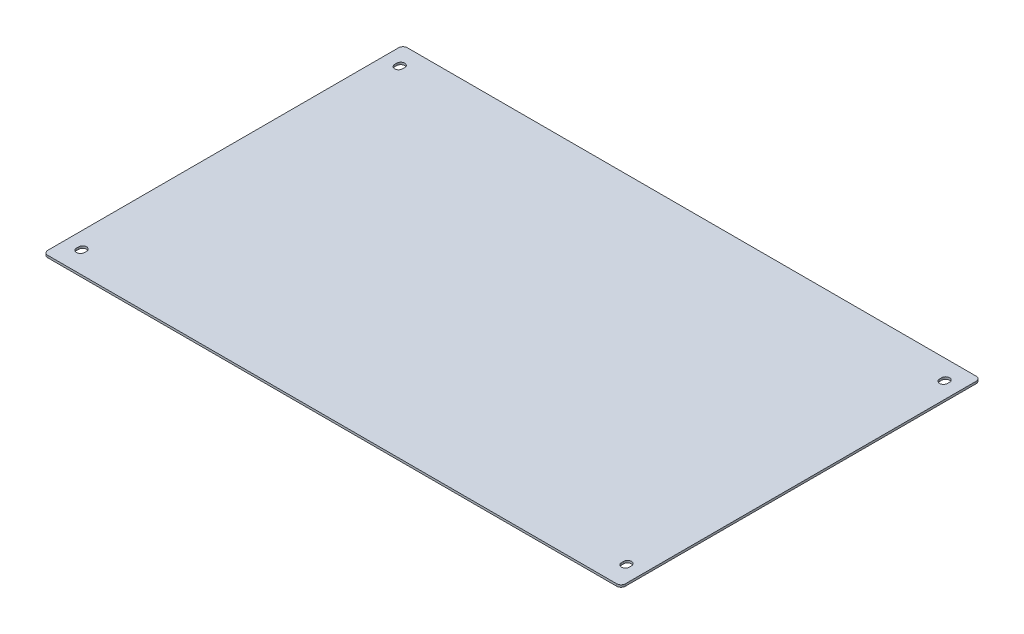
ISO-10303-21;
HEADER;
FILE_DESCRIPTION(('STEP AP214'),'2;1');
FILE_NAME('part.step','',(''),(''),'','','');
FILE_SCHEMA(('AUTOMOTIVE_DESIGN { 1 0 10303 214 1 1 1 1 }'));
ENDSEC;
DATA;
#1=APPLICATION_CONTEXT('core data for automotive mechanical design processes');
#2=APPLICATION_PROTOCOL_DEFINITION('international standard','automotive_design',2000,#1);
#3=PRODUCT_CONTEXT('',#1,'mechanical');
#4=PRODUCT('Part','Part','',(#3));
#5=PRODUCT_RELATED_PRODUCT_CATEGORY('part','',(#4));
#6=PRODUCT_DEFINITION_FORMATION('','',#4);
#7=PRODUCT_DEFINITION_CONTEXT('part definition',#1,'design');
#8=PRODUCT_DEFINITION('design','',#6,#7);
#9=PRODUCT_DEFINITION_SHAPE('','',#8);
#10=(LENGTH_UNIT() NAMED_UNIT(*) SI_UNIT(.MILLI.,.METRE.));
#11=(NAMED_UNIT(*) PLANE_ANGLE_UNIT() SI_UNIT($,.RADIAN.));
#12=(NAMED_UNIT(*) SI_UNIT($,.STERADIAN.) SOLID_ANGLE_UNIT());
#13=UNCERTAINTY_MEASURE_WITH_UNIT(LENGTH_MEASURE(1.E-05),#10,'distance_accuracy_value','');
#14=(GEOMETRIC_REPRESENTATION_CONTEXT(3) GLOBAL_UNCERTAINTY_ASSIGNED_CONTEXT((#13)) GLOBAL_UNIT_ASSIGNED_CONTEXT((#10,
#11,#12)) REPRESENTATION_CONTEXT('',''));
#15=CARTESIAN_POINT('',(0.,0.,0.));
#16=DIRECTION('',(0.,0.,1.));
#17=DIRECTION('',(1.,0.,0.));
#18=AXIS2_PLACEMENT_3D('',#15,#16,#17);
#19=CARTESIAN_POINT('',(0.,-1.,0.));
#20=DIRECTION('',(0.,-1.,0.));
#21=DIRECTION('',(0.,0.,-1.));
#22=AXIS2_PLACEMENT_3D('',#19,#20,#21);
#23=PLANE('',#22);
#24=DIRECTION('',(-1.,0.,0.));
#25=VECTOR('',#24,1.);
#26=CARTESIAN_POINT('',(-117.,-1.,-82.5));
#27=LINE('',#26,#25);
#28=CARTESIAN_POINT('',(130.534291735289,-1.0000000000001,-82.5));
#29=VERTEX_POINT('',#28);
#30=CARTESIAN_POINT('',(-130.534291735289,-1.0000000000001,-82.5));
#31=VERTEX_POINT('',#30);
#32=EDGE_CURVE('E97',#29,#31,#27,.T.);
#33=ORIENTED_EDGE('',*,*,#32,.F.);
#34=CARTESIAN_POINT('',(130.534291735289,-1.0000000000001,-80.5));
#35=DIRECTION('',(0.,1.,0.));
#36=DIRECTION('',(-1.,0.,0.));
#37=AXIS2_PLACEMENT_3D('',#34,#35,#36);
#38=CIRCLE('',#37,2.);
#39=CARTESIAN_POINT('',(132.534291735289,-1.0000000000001,-80.5));
#40=VERTEX_POINT('',#39);
#41=EDGE_CURVE('E304',#29,#40,#38,.F.);
#42=ORIENTED_EDGE('',*,*,#41,.T.);
#43=DIRECTION('',(0.,0.,1.));
#44=VECTOR('',#43,1.);
#45=CARTESIAN_POINT('',(132.534291735289,-1.0000000000001,0.));
#46=LINE('',#45,#44);
#47=CARTESIAN_POINT('',(132.534291735289,-1.0000000000001,80.5));
#48=VERTEX_POINT('',#47);
#49=EDGE_CURVE('E301',#40,#48,#46,.T.);
#50=ORIENTED_EDGE('',*,*,#49,.T.);
#51=CARTESIAN_POINT('',(130.534291735289,-1.0000000000001,80.5));
#52=DIRECTION('',(0.,1.,0.));
#53=DIRECTION('',(-1.,0.,0.));
#54=AXIS2_PLACEMENT_3D('',#51,#52,#53);
#55=CIRCLE('',#54,2.);
#56=CARTESIAN_POINT('',(130.534291735289,-1.0000000000001,82.5));
#57=VERTEX_POINT('',#56);
#58=EDGE_CURVE('E297',#48,#57,#55,.F.);
#59=ORIENTED_EDGE('',*,*,#58,.T.);
#60=DIRECTION('',(1.,0.,0.));
#61=VECTOR('',#60,1.);
#62=CARTESIAN_POINT('',(-117.,-1.,82.5));
#63=LINE('',#62,#61);
#64=CARTESIAN_POINT('',(-130.534291735289,-1.0000000000001,82.5));
#65=VERTEX_POINT('',#64);
#66=EDGE_CURVE('E13',#65,#57,#63,.T.);
#67=ORIENTED_EDGE('',*,*,#66,.F.);
#68=CARTESIAN_POINT('',(-130.534291735289,-1.0000000000001,80.5));
#69=DIRECTION('',(0.,1.,0.));
#70=DIRECTION('',(-1.,0.,0.));
#71=AXIS2_PLACEMENT_3D('',#68,#69,#70);
#72=CIRCLE('',#71,2.);
#73=CARTESIAN_POINT('',(-132.534291735289,-1.0000000000001,80.5));
#74=VERTEX_POINT('',#73);
#75=EDGE_CURVE('E450',#65,#74,#72,.F.);
#76=ORIENTED_EDGE('',*,*,#75,.T.);
#77=DIRECTION('',(0.,0.,-1.));
#78=VECTOR('',#77,1.);
#79=CARTESIAN_POINT('',(-132.534291735289,-1.0000000000001,0.));
#80=LINE('',#79,#78);
#81=CARTESIAN_POINT('',(-132.534291735289,-1.0000000000001,-80.5));
#82=VERTEX_POINT('',#81);
#83=EDGE_CURVE('E276',#74,#82,#80,.T.);
#84=ORIENTED_EDGE('',*,*,#83,.T.);
#85=CARTESIAN_POINT('',(-130.534291735289,-1.0000000000001,-80.5));
#86=DIRECTION('',(0.,1.,0.));
#87=DIRECTION('',(-1.,0.,0.));
#88=AXIS2_PLACEMENT_3D('',#85,#86,#87);
#89=CIRCLE('',#88,2.);
#90=EDGE_CURVE('E446',#82,#31,#89,.F.);
#91=ORIENTED_EDGE('',*,*,#90,.T.);
#92=EDGE_LOOP('',(#33,#42,#50,#59,#67,#76,#84,#91));
#93=FACE_BOUND('',#92,.T.);
#94=DIRECTION('',(0.,0.,-1.));
#95=VECTOR('',#94,1.);
#96=CARTESIAN_POINT('',(123.234291735288,-1.00000000000004,73.));
#97=LINE('',#96,#95);
#98=CARTESIAN_POINT('',(123.234291735288,-1.00000000000004,73.));
#99=VERTEX_POINT('',#98);
#100=CARTESIAN_POINT('',(123.234291735288,-1.00000000000004,72.));
#101=VERTEX_POINT('',#100);
#102=EDGE_CURVE('E307',#99,#101,#97,.T.);
#103=ORIENTED_EDGE('',*,*,#102,.F.);
#104=CARTESIAN_POINT('',(125.034291735289,-1.00000000000004,73.));
#105=DIRECTION('',(0.,-1.,0.));
#106=DIRECTION('',(1.,0.,0.));
#107=AXIS2_PLACEMENT_3D('',#104,#105,#106);
#108=CIRCLE('',#107,1.80000000000003);
#109=CARTESIAN_POINT('',(126.834291735289,-1.00000000000007,73.));
#110=VERTEX_POINT('',#109);
#111=EDGE_CURVE('E317',#110,#99,#108,.T.);
#112=ORIENTED_EDGE('',*,*,#111,.F.);
#113=DIRECTION('',(0.,0.,1.));
#114=VECTOR('',#113,1.);
#115=CARTESIAN_POINT('',(126.834291735289,-1.00000000000007,73.));
#116=LINE('',#115,#114);
#117=CARTESIAN_POINT('',(126.834291735289,-1.00000000000007,72.));
#118=VERTEX_POINT('',#117);
#119=EDGE_CURVE('E325',#118,#110,#116,.T.);
#120=ORIENTED_EDGE('',*,*,#119,.F.);
#121=CARTESIAN_POINT('',(125.034291735289,-1.00000000000004,72.));
#122=DIRECTION('',(0.,-1.,0.));
#123=DIRECTION('',(1.,0.,0.));
#124=AXIS2_PLACEMENT_3D('',#121,#122,#123);
#125=CIRCLE('',#124,1.80000000000003);
#126=EDGE_CURVE('E334',#101,#118,#125,.T.);
#127=ORIENTED_EDGE('',*,*,#126,.F.);
#128=EDGE_LOOP('',(#103,#112,#120,#127));
#129=FACE_BOUND('',#128,.T.);
#130=DIRECTION('',(0.,0.,-1.));
#131=VECTOR('',#130,1.);
#132=CARTESIAN_POINT('',(123.234291735288,-1.00000000000004,-73.));
#133=LINE('',#132,#131);
#134=CARTESIAN_POINT('',(123.234291735288,-1.00000000000004,-73.));
#135=VERTEX_POINT('',#134);
#136=CARTESIAN_POINT('',(123.234291735289,-1.00000000000004,-74.));
#137=VERTEX_POINT('',#136);
#138=EDGE_CURVE('E344',#135,#137,#133,.T.);
#139=ORIENTED_EDGE('',*,*,#138,.F.);
#140=CARTESIAN_POINT('',(125.034291735289,-1.00000000000004,-73.));
#141=DIRECTION('',(0.,-1.,0.));
#142=DIRECTION('',(1.,0.,0.));
#143=AXIS2_PLACEMENT_3D('',#140,#141,#142);
#144=CIRCLE('',#143,1.80000000000003);
#145=CARTESIAN_POINT('',(126.834291735289,-1.00000000000007,-73.));
#146=VERTEX_POINT('',#145);
#147=EDGE_CURVE('E354',#146,#135,#144,.T.);
#148=ORIENTED_EDGE('',*,*,#147,.F.);
#149=DIRECTION('',(0.,0.,1.));
#150=VECTOR('',#149,1.);
#151=CARTESIAN_POINT('',(126.834291735289,-1.00000000000007,-73.));
#152=LINE('',#151,#150);
#153=CARTESIAN_POINT('',(126.834291735289,-1.00000000000007,-74.));
#154=VERTEX_POINT('',#153);
#155=EDGE_CURVE('E362',#154,#146,#152,.T.);
#156=ORIENTED_EDGE('',*,*,#155,.F.);
#157=CARTESIAN_POINT('',(125.034291735289,-1.00000000000004,-74.));
#158=DIRECTION('',(0.,-1.,0.));
#159=DIRECTION('',(1.,0.,0.));
#160=AXIS2_PLACEMENT_3D('',#157,#158,#159);
#161=CIRCLE('',#160,1.80000000000002);
#162=EDGE_CURVE('E371',#137,#154,#161,.T.);
#163=ORIENTED_EDGE('',*,*,#162,.F.);
#164=EDGE_LOOP('',(#139,#148,#156,#163));
#165=FACE_BOUND('',#164,.T.);
#166=DIRECTION('',(0.,0.,1.));
#167=VECTOR('',#166,1.);
#168=CARTESIAN_POINT('',(-126.834291735289,-1.0000000000001,73.));
#169=LINE('',#168,#167);
#170=CARTESIAN_POINT('',(-126.834291735289,-1.0000000000001,72.));
#171=VERTEX_POINT('',#170);
#172=CARTESIAN_POINT('',(-126.834291735289,-1.0000000000001,73.));
#173=VERTEX_POINT('',#172);
#174=EDGE_CURVE('E431',#171,#173,#169,.T.);
#175=ORIENTED_EDGE('',*,*,#174,.T.);
#176=CARTESIAN_POINT('',(-125.034291735289,-1.0000000000001,73.));
#177=DIRECTION('',(0.,1.,0.));
#178=DIRECTION('',(-1.,0.,0.));
#179=AXIS2_PLACEMENT_3D('',#176,#177,#178);
#180=CIRCLE('',#179,1.80000000000003);
#181=CARTESIAN_POINT('',(-123.234291735289,-1.0000000000001,73.));
#182=VERTEX_POINT('',#181);
#183=EDGE_CURVE('E426',#173,#182,#180,.T.);
#184=ORIENTED_EDGE('',*,*,#183,.T.);
#185=DIRECTION('',(0.,0.,-1.));
#186=VECTOR('',#185,1.);
#187=CARTESIAN_POINT('',(-123.234291735289,-1.0000000000001,73.));
#188=LINE('',#187,#186);
#189=CARTESIAN_POINT('',(-123.234291735289,-1.00000000000004,72.));
#190=VERTEX_POINT('',#189);
#191=EDGE_CURVE('E421',#182,#190,#188,.T.);
#192=ORIENTED_EDGE('',*,*,#191,.T.);
#193=CARTESIAN_POINT('',(-125.034291735289,-1.0000000000001,72.));
#194=DIRECTION('',(0.,1.,0.));
#195=DIRECTION('',(-1.,0.,0.));
#196=AXIS2_PLACEMENT_3D('',#193,#194,#195);
#197=CIRCLE('',#196,1.80000000000003);
#198=EDGE_CURVE('E416',#190,#171,#197,.T.);
#199=ORIENTED_EDGE('',*,*,#198,.T.);
#200=EDGE_LOOP('',(#175,#184,#192,#199));
#201=FACE_BOUND('',#200,.T.);
#202=DIRECTION('',(0.,0.,1.));
#203=VECTOR('',#202,1.);
#204=CARTESIAN_POINT('',(-126.834291735289,-1.0000000000001,-73.));
#205=LINE('',#204,#203);
#206=CARTESIAN_POINT('',(-126.834291735289,-1.0000000000001,-74.));
#207=VERTEX_POINT('',#206);
#208=CARTESIAN_POINT('',(-126.834291735289,-1.0000000000001,-73.));
#209=VERTEX_POINT('',#208);
#210=EDGE_CURVE('E411',#207,#209,#205,.T.);
#211=ORIENTED_EDGE('',*,*,#210,.T.);
#212=CARTESIAN_POINT('',(-125.034291735289,-1.0000000000001,-73.));
#213=DIRECTION('',(0.,1.,0.));
#214=DIRECTION('',(-1.,0.,0.));
#215=AXIS2_PLACEMENT_3D('',#212,#213,#214);
#216=CIRCLE('',#215,1.80000000000003);
#217=CARTESIAN_POINT('',(-123.234291735289,-1.0000000000001,-73.));
#218=VERTEX_POINT('',#217);
#219=EDGE_CURVE('E406',#209,#218,#216,.T.);
#220=ORIENTED_EDGE('',*,*,#219,.T.);
#221=DIRECTION('',(0.,0.,-1.));
#222=VECTOR('',#221,1.);
#223=CARTESIAN_POINT('',(-123.234291735289,-1.0000000000001,-73.));
#224=LINE('',#223,#222);
#225=CARTESIAN_POINT('',(-123.234291735289,-1.00000000000004,-74.));
#226=VERTEX_POINT('',#225);
#227=EDGE_CURVE('E401',#218,#226,#224,.T.);
#228=ORIENTED_EDGE('',*,*,#227,.T.);
#229=CARTESIAN_POINT('',(-125.034291735289,-1.0000000000001,-74.));
#230=DIRECTION('',(0.,1.,0.));
#231=DIRECTION('',(-1.,0.,0.));
#232=AXIS2_PLACEMENT_3D('',#229,#230,#231);
#233=CIRCLE('',#232,1.80000000000002);
#234=EDGE_CURVE('E394',#226,#207,#233,.T.);
#235=ORIENTED_EDGE('',*,*,#234,.T.);
#236=EDGE_LOOP('',(#211,#220,#228,#235));
#237=FACE_BOUND('',#236,.T.);
#238=ADVANCED_FACE('F86',(#93,#129,#165,#201,#237),#23,.T.);
#239=CARTESIAN_POINT('',(0.,0.,0.));
#240=DIRECTION('',(0.,-1.,0.));
#241=DIRECTION('',(0.,0.,-1.));
#242=AXIS2_PLACEMENT_3D('',#239,#240,#241);
#243=PLANE('',#242);
#244=DIRECTION('',(1.,0.,0.));
#245=VECTOR('',#244,1.);
#246=CARTESIAN_POINT('',(-117.,0.,82.5));
#247=LINE('',#246,#245);
#248=CARTESIAN_POINT('',(-130.534291735289,0.,82.5));
#249=VERTEX_POINT('',#248);
#250=CARTESIAN_POINT('',(130.534291735289,0.,82.5));
#251=VERTEX_POINT('',#250);
#252=EDGE_CURVE('E90',#249,#251,#247,.T.);
#253=ORIENTED_EDGE('',*,*,#252,.T.);
#254=CARTESIAN_POINT('',(130.534291735289,0.,80.5));
#255=DIRECTION('',(0.,1.,0.));
#256=DIRECTION('',(-1.,0.,0.));
#257=AXIS2_PLACEMENT_3D('',#254,#255,#256);
#258=CIRCLE('',#257,2.);
#259=CARTESIAN_POINT('',(132.534291735289,0.,80.5));
#260=VERTEX_POINT('',#259);
#261=EDGE_CURVE('E106',#251,#260,#258,.T.);
#262=ORIENTED_EDGE('',*,*,#261,.T.);
#263=DIRECTION('',(0.,0.,-1.));
#264=VECTOR('',#263,1.);
#265=CARTESIAN_POINT('',(132.534291735289,0.,82.5));
#266=LINE('',#265,#264);
#267=CARTESIAN_POINT('',(132.534291735289,0.,-80.5));
#268=VERTEX_POINT('',#267);
#269=EDGE_CURVE('E382',#268,#260,#266,.F.);
#270=ORIENTED_EDGE('',*,*,#269,.F.);
#271=CARTESIAN_POINT('',(130.534291735289,0.,-80.5));
#272=DIRECTION('',(0.,1.,0.));
#273=DIRECTION('',(-1.,0.,0.));
#274=AXIS2_PLACEMENT_3D('',#271,#272,#273);
#275=CIRCLE('',#274,2.);
#276=CARTESIAN_POINT('',(130.534291735289,0.,-82.5));
#277=VERTEX_POINT('',#276);
#278=EDGE_CURVE('E291',#268,#277,#275,.T.);
#279=ORIENTED_EDGE('',*,*,#278,.T.);
#280=DIRECTION('',(-1.,0.,0.));
#281=VECTOR('',#280,1.);
#282=CARTESIAN_POINT('',(-117.,0.,-82.5));
#283=LINE('',#282,#281);
#284=CARTESIAN_POINT('',(-130.534291735289,0.,-82.5));
#285=VERTEX_POINT('',#284);
#286=EDGE_CURVE('E252',#277,#285,#283,.T.);
#287=ORIENTED_EDGE('',*,*,#286,.T.);
#288=CARTESIAN_POINT('',(-130.534291735289,0.,-80.5));
#289=DIRECTION('',(0.,1.,0.));
#290=DIRECTION('',(-1.,0.,0.));
#291=AXIS2_PLACEMENT_3D('',#288,#289,#290);
#292=CIRCLE('',#291,2.);
#293=CARTESIAN_POINT('',(-132.534291735289,0.,-80.5));
#294=VERTEX_POINT('',#293);
#295=EDGE_CURVE('E267',#285,#294,#292,.T.);
#296=ORIENTED_EDGE('',*,*,#295,.T.);
#297=DIRECTION('',(0.,0.,1.));
#298=VECTOR('',#297,1.);
#299=CARTESIAN_POINT('',(-132.534291735289,0.,-82.5));
#300=LINE('',#299,#298);
#301=CARTESIAN_POINT('',(-132.534291735289,0.,80.5));
#302=VERTEX_POINT('',#301);
#303=EDGE_CURVE('E273',#302,#294,#300,.F.);
#304=ORIENTED_EDGE('',*,*,#303,.F.);
#305=CARTESIAN_POINT('',(-130.534291735289,0.,80.5));
#306=DIRECTION('',(0.,1.,0.));
#307=DIRECTION('',(-1.,0.,0.));
#308=AXIS2_PLACEMENT_3D('',#305,#306,#307);
#309=CIRCLE('',#308,2.);
#310=EDGE_CURVE('E258',#302,#249,#309,.T.);
#311=ORIENTED_EDGE('',*,*,#310,.T.);
#312=EDGE_LOOP('',(#253,#262,#270,#279,#287,#296,#304,#311));
#313=FACE_BOUND('',#312,.T.);
#314=CARTESIAN_POINT('',(125.034291735289,0.,73.));
#315=DIRECTION('',(0.,1.,0.));
#316=DIRECTION('',(-1.,0.,0.));
#317=AXIS2_PLACEMENT_3D('',#314,#315,#316);
#318=CIRCLE('',#317,1.80000000000003);
#319=CARTESIAN_POINT('',(123.234291735288,0.,73.));
#320=VERTEX_POINT('',#319);
#321=CARTESIAN_POINT('',(126.834291735289,0.,73.));
#322=VERTEX_POINT('',#321);
#323=EDGE_CURVE('E322',#320,#322,#318,.T.);
#324=ORIENTED_EDGE('',*,*,#323,.F.);
#325=DIRECTION('',(0.,0.,1.));
#326=VECTOR('',#325,1.);
#327=CARTESIAN_POINT('',(123.234291735288,0.,0.));
#328=LINE('',#327,#326);
#329=CARTESIAN_POINT('',(123.234291735288,0.,72.));
#330=VERTEX_POINT('',#329);
#331=EDGE_CURVE('E314',#330,#320,#328,.T.);
#332=ORIENTED_EDGE('',*,*,#331,.F.);
#333=CARTESIAN_POINT('',(125.034291735289,0.,72.));
#334=DIRECTION('',(0.,1.,0.));
#335=DIRECTION('',(-1.,0.,0.));
#336=AXIS2_PLACEMENT_3D('',#333,#334,#335);
#337=CIRCLE('',#336,1.80000000000003);
#338=CARTESIAN_POINT('',(126.834291735289,0.,72.));
#339=VERTEX_POINT('',#338);
#340=EDGE_CURVE('E340',#339,#330,#337,.T.);
#341=ORIENTED_EDGE('',*,*,#340,.F.);
#342=DIRECTION('',(0.,0.,-1.));
#343=VECTOR('',#342,1.);
#344=CARTESIAN_POINT('',(126.834291735289,0.,0.));
#345=LINE('',#344,#343);
#346=EDGE_CURVE('E331',#322,#339,#345,.T.);
#347=ORIENTED_EDGE('',*,*,#346,.F.);
#348=EDGE_LOOP('',(#324,#332,#341,#347));
#349=FACE_BOUND('',#348,.T.);
#350=CARTESIAN_POINT('',(125.034291735289,0.,-73.));
#351=DIRECTION('',(0.,1.,0.));
#352=DIRECTION('',(-1.,0.,0.));
#353=AXIS2_PLACEMENT_3D('',#350,#351,#352);
#354=CIRCLE('',#353,1.80000000000003);
#355=CARTESIAN_POINT('',(123.234291735289,0.,-73.));
#356=VERTEX_POINT('',#355);
#357=CARTESIAN_POINT('',(126.834291735289,0.,-73.));
#358=VERTEX_POINT('',#357);
#359=EDGE_CURVE('E359',#356,#358,#354,.T.);
#360=ORIENTED_EDGE('',*,*,#359,.F.);
#361=DIRECTION('',(0.,0.,1.));
#362=VECTOR('',#361,1.);
#363=CARTESIAN_POINT('',(123.234291735287,0.,1.33573707650198E-13));
#364=LINE('',#363,#362);
#365=CARTESIAN_POINT('',(123.234291735289,0.,-74.));
#366=VERTEX_POINT('',#365);
#367=EDGE_CURVE('E351',#366,#356,#364,.T.);
#368=ORIENTED_EDGE('',*,*,#367,.F.);
#369=CARTESIAN_POINT('',(125.034291735289,0.,-74.));
#370=DIRECTION('',(0.,1.,0.));
#371=DIRECTION('',(-1.,0.,0.));
#372=AXIS2_PLACEMENT_3D('',#369,#370,#371);
#373=CIRCLE('',#372,1.80000000000002);
#374=CARTESIAN_POINT('',(126.834291735289,0.,-74.));
#375=VERTEX_POINT('',#374);
#376=EDGE_CURVE('E377',#375,#366,#373,.T.);
#377=ORIENTED_EDGE('',*,*,#376,.F.);
#378=DIRECTION('',(0.,0.,-1.));
#379=VECTOR('',#378,1.);
#380=CARTESIAN_POINT('',(126.83429173529,0.,-1.96023752785408E-13));
#381=LINE('',#380,#379);
#382=EDGE_CURVE('E368',#358,#375,#381,.T.);
#383=ORIENTED_EDGE('',*,*,#382,.F.);
#384=EDGE_LOOP('',(#360,#368,#377,#383));
#385=FACE_BOUND('',#384,.T.);
#386=CARTESIAN_POINT('',(-125.034291735289,0.,73.));
#387=DIRECTION('',(0.,1.,0.));
#388=DIRECTION('',(-1.,0.,0.));
#389=AXIS2_PLACEMENT_3D('',#386,#387,#388);
#390=CIRCLE('',#389,1.80000000000003);
#391=CARTESIAN_POINT('',(-126.834291735289,0.,73.));
#392=VERTEX_POINT('',#391);
#393=CARTESIAN_POINT('',(-123.234291735289,0.,73.));
#394=VERTEX_POINT('',#393);
#395=EDGE_CURVE('E474',#392,#394,#390,.T.);
#396=ORIENTED_EDGE('',*,*,#395,.F.);
#397=DIRECTION('',(0.,0.,1.));
#398=VECTOR('',#397,1.);
#399=CARTESIAN_POINT('',(-126.834291735289,0.,0.));
#400=LINE('',#399,#398);
#401=CARTESIAN_POINT('',(-126.834291735289,0.,72.));
#402=VERTEX_POINT('',#401);
#403=EDGE_CURVE('E468',#402,#392,#400,.T.);
#404=ORIENTED_EDGE('',*,*,#403,.F.);
#405=CARTESIAN_POINT('',(-125.034291735289,0.,72.));
#406=DIRECTION('',(0.,1.,0.));
#407=DIRECTION('',(-1.,0.,0.));
#408=AXIS2_PLACEMENT_3D('',#405,#406,#407);
#409=CIRCLE('',#408,1.80000000000003);
#410=CARTESIAN_POINT('',(-123.234291735289,0.,72.));
#411=VERTEX_POINT('',#410);
#412=EDGE_CURVE('E486',#411,#402,#409,.T.);
#413=ORIENTED_EDGE('',*,*,#412,.F.);
#414=DIRECTION('',(0.,0.,-1.));
#415=VECTOR('',#414,1.);
#416=CARTESIAN_POINT('',(-123.234291735289,0.,0.));
#417=LINE('',#416,#415);
#418=EDGE_CURVE('E480',#394,#411,#417,.T.);
#419=ORIENTED_EDGE('',*,*,#418,.F.);
#420=EDGE_LOOP('',(#396,#404,#413,#419));
#421=FACE_BOUND('',#420,.T.);
#422=CARTESIAN_POINT('',(-125.034291735289,0.,-73.));
#423=DIRECTION('',(0.,1.,0.));
#424=DIRECTION('',(-1.,0.,0.));
#425=AXIS2_PLACEMENT_3D('',#422,#423,#424);
#426=CIRCLE('',#425,1.80000000000003);
#427=CARTESIAN_POINT('',(-126.834291735289,0.,-73.));
#428=VERTEX_POINT('',#427);
#429=CARTESIAN_POINT('',(-123.234291735289,0.,-73.));
#430=VERTEX_POINT('',#429);
#431=EDGE_CURVE('E498',#428,#430,#426,.T.);
#432=ORIENTED_EDGE('',*,*,#431,.F.);
#433=DIRECTION('',(0.,0.,1.));
#434=VECTOR('',#433,1.);
#435=CARTESIAN_POINT('',(-126.834291735291,0.,-1.96023752785422E-13));
#436=LINE('',#435,#434);
#437=CARTESIAN_POINT('',(-126.834291735289,0.,-74.));
#438=VERTEX_POINT('',#437);
#439=EDGE_CURVE('E492',#438,#428,#436,.T.);
#440=ORIENTED_EDGE('',*,*,#439,.F.);
#441=CARTESIAN_POINT('',(-125.034291735289,0.,-74.));
#442=DIRECTION('',(0.,1.,0.));
#443=DIRECTION('',(-1.,0.,0.));
#444=AXIS2_PLACEMENT_3D('',#441,#442,#443);
#445=CIRCLE('',#444,1.80000000000002);
#446=CARTESIAN_POINT('',(-123.234291735289,0.,-74.));
#447=VERTEX_POINT('',#446);
#448=EDGE_CURVE('E277',#447,#438,#445,.T.);
#449=ORIENTED_EDGE('',*,*,#448,.F.);
#450=DIRECTION('',(0.,0.,-1.));
#451=VECTOR('',#450,1.);
#452=CARTESIAN_POINT('',(-123.234291735288,0.,1.33573707650212E-13));
#453=LINE('',#452,#451);
#454=EDGE_CURVE('E504',#430,#447,#453,.T.);
#455=ORIENTED_EDGE('',*,*,#454,.F.);
#456=EDGE_LOOP('',(#432,#440,#449,#455));
#457=FACE_BOUND('',#456,.T.);
#458=ADVANCED_FACE('F88',(#313,#349,#385,#421,#457),#243,.F.);
#459=CARTESIAN_POINT('',(-117.,-1.,-82.5));
#460=DIRECTION('',(0.,0.,-1.));
#461=DIRECTION('',(-1.,0.,0.));
#462=AXIS2_PLACEMENT_3D('',#459,#460,#461);
#463=PLANE('',#462);
#464=ORIENTED_EDGE('',*,*,#286,.F.);
#465=DIRECTION('',(0.,1.,0.));
#466=VECTOR('',#465,1.);
#467=CARTESIAN_POINT('',(130.534291735289,-1.00000000000008,-82.5));
#468=LINE('',#467,#466);
#469=EDGE_CURVE('E294',#277,#29,#468,.F.);
#470=ORIENTED_EDGE('',*,*,#469,.T.);
#471=ORIENTED_EDGE('',*,*,#32,.T.);
#472=DIRECTION('',(0.,1.,0.));
#473=VECTOR('',#472,1.);
#474=CARTESIAN_POINT('',(-130.534291735289,-1.0000000000001,-82.5));
#475=LINE('',#474,#473);
#476=EDGE_CURVE('E266',#31,#285,#475,.T.);
#477=ORIENTED_EDGE('',*,*,#476,.T.);
#478=EDGE_LOOP('',(#464,#470,#471,#477));
#479=FACE_BOUND('',#478,.T.);
#480=ADVANCED_FACE('F543',(#479),#463,.T.);
#481=CARTESIAN_POINT('',(-117.,-1.,82.5));
#482=DIRECTION('',(0.,0.,1.));
#483=DIRECTION('',(1.,0.,0.));
#484=AXIS2_PLACEMENT_3D('',#481,#482,#483);
#485=PLANE('',#484);
#486=ORIENTED_EDGE('',*,*,#66,.T.);
#487=DIRECTION('',(0.,1.,0.));
#488=VECTOR('',#487,1.);
#489=CARTESIAN_POINT('',(130.534291735289,-1.0000000000001,82.5));
#490=LINE('',#489,#488);
#491=EDGE_CURVE('E287',#57,#251,#490,.T.);
#492=ORIENTED_EDGE('',*,*,#491,.T.);
#493=ORIENTED_EDGE('',*,*,#252,.F.);
#494=DIRECTION('',(0.,1.,0.));
#495=VECTOR('',#494,1.);
#496=CARTESIAN_POINT('',(-130.534291735289,-1.00000000000008,82.5));
#497=LINE('',#496,#495);
#498=EDGE_CURVE('E263',#249,#65,#497,.F.);
#499=ORIENTED_EDGE('',*,*,#498,.T.);
#500=EDGE_LOOP('',(#486,#492,#493,#499));
#501=FACE_BOUND('',#500,.T.);
#502=ADVANCED_FACE('F549',(#501),#485,.T.);
#503=CARTESIAN_POINT('',(130.534291735289,-1.0000000000001,80.5));
#504=DIRECTION('',(0.,1.,0.));
#505=DIRECTION('',(-1.,0.,0.));
#506=AXIS2_PLACEMENT_3D('',#503,#504,#505);
#507=CYLINDRICAL_SURFACE('',#506,2.);
#508=ORIENTED_EDGE('',*,*,#58,.F.);
#509=DIRECTION('',(0.,1.,0.));
#510=VECTOR('',#509,1.);
#511=CARTESIAN_POINT('',(132.534291735289,-1.0000000000001,80.5));
#512=LINE('',#511,#510);
#513=EDGE_CURVE('E177',#260,#48,#512,.F.);
#514=ORIENTED_EDGE('',*,*,#513,.F.);
#515=ORIENTED_EDGE('',*,*,#261,.F.);
#516=ORIENTED_EDGE('',*,*,#491,.F.);
#517=EDGE_LOOP('',(#508,#514,#515,#516));
#518=FACE_BOUND('',#517,.T.);
#519=ADVANCED_FACE('F551',(#518),#507,.T.);
#520=CARTESIAN_POINT('',(132.534291735289,-1.0000000000001,82.5));
#521=DIRECTION('',(-1.,0.,0.));
#522=DIRECTION('',(0.,-1.,0.));
#523=AXIS2_PLACEMENT_3D('',#520,#521,#522);
#524=PLANE('',#523);
#525=ORIENTED_EDGE('',*,*,#49,.F.);
#526=DIRECTION('',(0.,1.,0.));
#527=VECTOR('',#526,1.);
#528=CARTESIAN_POINT('',(132.534291735289,-1.0000000000001,-80.5));
#529=LINE('',#528,#527);
#530=EDGE_CURVE('E385',#40,#268,#529,.T.);
#531=ORIENTED_EDGE('',*,*,#530,.T.);
#532=ORIENTED_EDGE('',*,*,#269,.T.);
#533=ORIENTED_EDGE('',*,*,#513,.T.);
#534=EDGE_LOOP('',(#525,#531,#532,#533));
#535=FACE_BOUND('',#534,.T.);
#536=ADVANCED_FACE('F564',(#535),#524,.F.);
#537=CARTESIAN_POINT('',(130.534291735289,-1.00000000000008,-80.5));
#538=DIRECTION('',(0.,1.,0.));
#539=DIRECTION('',(-1.,0.,0.));
#540=AXIS2_PLACEMENT_3D('',#537,#538,#539);
#541=CYLINDRICAL_SURFACE('',#540,2.);
#542=ORIENTED_EDGE('',*,*,#41,.F.);
#543=ORIENTED_EDGE('',*,*,#469,.F.);
#544=ORIENTED_EDGE('',*,*,#278,.F.);
#545=ORIENTED_EDGE('',*,*,#530,.F.);
#546=EDGE_LOOP('',(#542,#543,#544,#545));
#547=FACE_BOUND('',#546,.T.);
#548=ADVANCED_FACE('F562',(#547),#541,.T.);
#549=CARTESIAN_POINT('',(125.03429173529,233.,-74.));
#550=DIRECTION('',(0.,-1.,0.));
#551=DIRECTION('',(1.,0.,0.));
#552=AXIS2_PLACEMENT_3D('',#549,#550,#551);
#553=CYLINDRICAL_SURFACE('',#552,1.80000000000002);
#554=ORIENTED_EDGE('',*,*,#376,.T.);
#555=DIRECTION('',(0.,-1.,0.));
#556=VECTOR('',#555,1.);
#557=CARTESIAN_POINT('',(123.23429173529,233.,-74.));
#558=LINE('',#557,#556);
#559=EDGE_CURVE('E375',#366,#137,#558,.T.);
#560=ORIENTED_EDGE('',*,*,#559,.T.);
#561=ORIENTED_EDGE('',*,*,#162,.T.);
#562=DIRECTION('',(0.,-1.,0.));
#563=VECTOR('',#562,1.);
#564=CARTESIAN_POINT('',(126.83429173529,233.,-74.));
#565=LINE('',#564,#563);
#566=EDGE_CURVE('E366',#375,#154,#565,.T.);
#567=ORIENTED_EDGE('',*,*,#566,.F.);
#568=EDGE_LOOP('',(#554,#560,#561,#567));
#569=FACE_BOUND('',#568,.T.);
#570=ADVANCED_FACE('F579',(#569),#553,.F.);
#571=CARTESIAN_POINT('',(126.83429173529,233.,-73.));
#572=DIRECTION('',(1.,0.,0.));
#573=DIRECTION('',(0.,0.,1.));
#574=AXIS2_PLACEMENT_3D('',#571,#572,#573);
#575=PLANE('',#574);
#576=ORIENTED_EDGE('',*,*,#382,.T.);
#577=ORIENTED_EDGE('',*,*,#566,.T.);
#578=ORIENTED_EDGE('',*,*,#155,.T.);
#579=DIRECTION('',(0.,-1.,0.));
#580=VECTOR('',#579,1.);
#581=CARTESIAN_POINT('',(126.83429173529,233.,-73.));
#582=LINE('',#581,#580);
#583=EDGE_CURVE('E357',#358,#146,#582,.T.);
#584=ORIENTED_EDGE('',*,*,#583,.F.);
#585=EDGE_LOOP('',(#576,#577,#578,#584));
#586=FACE_BOUND('',#585,.T.);
#587=ADVANCED_FACE('F582',(#586),#575,.F.);
#588=CARTESIAN_POINT('',(125.03429173529,233.,-73.));
#589=DIRECTION('',(0.,-1.,0.));
#590=DIRECTION('',(1.,0.,0.));
#591=AXIS2_PLACEMENT_3D('',#588,#589,#590);
#592=CYLINDRICAL_SURFACE('',#591,1.80000000000003);
#593=ORIENTED_EDGE('',*,*,#359,.T.);
#594=ORIENTED_EDGE('',*,*,#583,.T.);
#595=ORIENTED_EDGE('',*,*,#147,.T.);
#596=DIRECTION('',(0.,-1.,0.));
#597=VECTOR('',#596,1.);
#598=CARTESIAN_POINT('',(123.23429173529,233.,-73.));
#599=LINE('',#598,#597);
#600=EDGE_CURVE('E348',#356,#135,#599,.T.);
#601=ORIENTED_EDGE('',*,*,#600,.F.);
#602=EDGE_LOOP('',(#593,#594,#595,#601));
#603=FACE_BOUND('',#602,.T.);
#604=ADVANCED_FACE('F586',(#603),#592,.F.);
#605=CARTESIAN_POINT('',(123.23429173529,233.,-73.));
#606=DIRECTION('',(-1.,0.,0.));
#607=DIRECTION('',(0.,0.,-1.));
#608=AXIS2_PLACEMENT_3D('',#605,#606,#607);
#609=PLANE('',#608);
#610=ORIENTED_EDGE('',*,*,#367,.T.);
#611=ORIENTED_EDGE('',*,*,#600,.T.);
#612=ORIENTED_EDGE('',*,*,#138,.T.);
#613=ORIENTED_EDGE('',*,*,#559,.F.);
#614=EDGE_LOOP('',(#610,#611,#612,#613));
#615=FACE_BOUND('',#614,.T.);
#616=ADVANCED_FACE('F590',(#615),#609,.F.);
#617=CARTESIAN_POINT('',(125.03429173529,233.,72.));
#618=DIRECTION('',(0.,-1.,0.));
#619=DIRECTION('',(1.,0.,0.));
#620=AXIS2_PLACEMENT_3D('',#617,#618,#619);
#621=CYLINDRICAL_SURFACE('',#620,1.80000000000003);
#622=ORIENTED_EDGE('',*,*,#340,.T.);
#623=DIRECTION('',(0.,-1.,0.));
#624=VECTOR('',#623,1.);
#625=CARTESIAN_POINT('',(123.23429173529,233.,72.));
#626=LINE('',#625,#624);
#627=EDGE_CURVE('E338',#330,#101,#626,.T.);
#628=ORIENTED_EDGE('',*,*,#627,.T.);
#629=ORIENTED_EDGE('',*,*,#126,.T.);
#630=DIRECTION('',(0.,-1.,0.));
#631=VECTOR('',#630,1.);
#632=CARTESIAN_POINT('',(126.83429173529,233.,72.));
#633=LINE('',#632,#631);
#634=EDGE_CURVE('E329',#339,#118,#633,.T.);
#635=ORIENTED_EDGE('',*,*,#634,.F.);
#636=EDGE_LOOP('',(#622,#628,#629,#635));
#637=FACE_BOUND('',#636,.T.);
#638=ADVANCED_FACE('F594',(#637),#621,.F.);
#639=CARTESIAN_POINT('',(126.83429173529,233.,73.));
#640=DIRECTION('',(1.,0.,0.));
#641=DIRECTION('',(0.,1.,0.));
#642=AXIS2_PLACEMENT_3D('',#639,#640,#641);
#643=PLANE('',#642);
#644=ORIENTED_EDGE('',*,*,#346,.T.);
#645=ORIENTED_EDGE('',*,*,#634,.T.);
#646=ORIENTED_EDGE('',*,*,#119,.T.);
#647=DIRECTION('',(0.,-1.,0.));
#648=VECTOR('',#647,1.);
#649=CARTESIAN_POINT('',(126.83429173529,233.,73.));
#650=LINE('',#649,#648);
#651=EDGE_CURVE('E320',#322,#110,#650,.T.);
#652=ORIENTED_EDGE('',*,*,#651,.F.);
#653=EDGE_LOOP('',(#644,#645,#646,#652));
#654=FACE_BOUND('',#653,.T.);
#655=ADVANCED_FACE('F598',(#654),#643,.F.);
#656=CARTESIAN_POINT('',(125.03429173529,233.,73.));
#657=DIRECTION('',(0.,-1.,0.));
#658=DIRECTION('',(1.,0.,0.));
#659=AXIS2_PLACEMENT_3D('',#656,#657,#658);
#660=CYLINDRICAL_SURFACE('',#659,1.80000000000003);
#661=ORIENTED_EDGE('',*,*,#323,.T.);
#662=ORIENTED_EDGE('',*,*,#651,.T.);
#663=ORIENTED_EDGE('',*,*,#111,.T.);
#664=DIRECTION('',(0.,-1.,0.));
#665=VECTOR('',#664,1.);
#666=CARTESIAN_POINT('',(123.23429173529,233.,73.));
#667=LINE('',#666,#665);
#668=EDGE_CURVE('E311',#320,#99,#667,.T.);
#669=ORIENTED_EDGE('',*,*,#668,.F.);
#670=EDGE_LOOP('',(#661,#662,#663,#669));
#671=FACE_BOUND('',#670,.T.);
#672=ADVANCED_FACE('F601',(#671),#660,.F.);
#673=CARTESIAN_POINT('',(123.23429173529,233.,73.));
#674=DIRECTION('',(-1.,0.,0.));
#675=DIRECTION('',(0.,-1.,0.));
#676=AXIS2_PLACEMENT_3D('',#673,#674,#675);
#677=PLANE('',#676);
#678=ORIENTED_EDGE('',*,*,#331,.T.);
#679=ORIENTED_EDGE('',*,*,#668,.T.);
#680=ORIENTED_EDGE('',*,*,#102,.T.);
#681=ORIENTED_EDGE('',*,*,#627,.F.);
#682=EDGE_LOOP('',(#678,#679,#680,#681));
#683=FACE_BOUND('',#682,.T.);
#684=ADVANCED_FACE('F547',(#683),#677,.F.);
#685=CARTESIAN_POINT('',(-130.534291735289,-1.00000000000008,80.5));
#686=DIRECTION('',(0.,1.,0.));
#687=DIRECTION('',(-1.,0.,0.));
#688=AXIS2_PLACEMENT_3D('',#685,#686,#687);
#689=CYLINDRICAL_SURFACE('',#688,2.);
#690=ORIENTED_EDGE('',*,*,#75,.F.);
#691=ORIENTED_EDGE('',*,*,#498,.F.);
#692=ORIENTED_EDGE('',*,*,#310,.F.);
#693=DIRECTION('',(0.,1.,0.));
#694=VECTOR('',#693,1.);
#695=CARTESIAN_POINT('',(-132.534291735289,-1.0000000000001,80.5));
#696=LINE('',#695,#694);
#697=EDGE_CURVE('E262',#74,#302,#696,.T.);
#698=ORIENTED_EDGE('',*,*,#697,.F.);
#699=EDGE_LOOP('',(#690,#691,#692,#698));
#700=FACE_BOUND('',#699,.T.);
#701=ADVANCED_FACE('F261',(#700),#689,.T.);
#702=CARTESIAN_POINT('',(-130.534291735289,-1.0000000000001,-80.5));
#703=DIRECTION('',(0.,1.,0.));
#704=DIRECTION('',(-1.,0.,0.));
#705=AXIS2_PLACEMENT_3D('',#702,#703,#704);
#706=CYLINDRICAL_SURFACE('',#705,2.);
#707=ORIENTED_EDGE('',*,*,#90,.F.);
#708=DIRECTION('',(0.,1.,0.));
#709=VECTOR('',#708,1.);
#710=CARTESIAN_POINT('',(-132.534291735289,-1.0000000000001,-80.5));
#711=LINE('',#710,#709);
#712=EDGE_CURVE('E278',#294,#82,#711,.F.);
#713=ORIENTED_EDGE('',*,*,#712,.F.);
#714=ORIENTED_EDGE('',*,*,#295,.F.);
#715=ORIENTED_EDGE('',*,*,#476,.F.);
#716=EDGE_LOOP('',(#707,#713,#714,#715));
#717=FACE_BOUND('',#716,.T.);
#718=ADVANCED_FACE('F710',(#717),#706,.T.);
#719=CARTESIAN_POINT('',(-132.534291735289,-1.0000000000001,-82.5));
#720=DIRECTION('',(1.,0.,0.));
#721=DIRECTION('',(0.,1.,0.));
#722=AXIS2_PLACEMENT_3D('',#719,#720,#721);
#723=PLANE('',#722);
#724=ORIENTED_EDGE('',*,*,#303,.T.);
#725=ORIENTED_EDGE('',*,*,#712,.T.);
#726=ORIENTED_EDGE('',*,*,#83,.F.);
#727=ORIENTED_EDGE('',*,*,#697,.T.);
#728=EDGE_LOOP('',(#724,#725,#726,#727));
#729=FACE_BOUND('',#728,.T.);
#730=ADVANCED_FACE('F272',(#729),#723,.F.);
#731=CARTESIAN_POINT('',(-125.034291735289,-1.0000000000001,-74.));
#732=DIRECTION('',(0.,1.,0.));
#733=DIRECTION('',(-1.,0.,0.));
#734=AXIS2_PLACEMENT_3D('',#731,#732,#733);
#735=CYLINDRICAL_SURFACE('',#734,1.80000000000002);
#736=ORIENTED_EDGE('',*,*,#448,.T.);
#737=DIRECTION('',(0.,1.,0.));
#738=VECTOR('',#737,1.);
#739=CARTESIAN_POINT('',(-126.834291735289,-1.0000000000001,-74.));
#740=LINE('',#739,#738);
#741=EDGE_CURVE('E489',#207,#438,#740,.T.);
#742=ORIENTED_EDGE('',*,*,#741,.F.);
#743=ORIENTED_EDGE('',*,*,#234,.F.);
#744=DIRECTION('',(0.,1.,0.));
#745=VECTOR('',#744,1.);
#746=CARTESIAN_POINT('',(-123.234291735289,-1.0000000000001,-74.));
#747=LINE('',#746,#745);
#748=EDGE_CURVE('E507',#226,#447,#747,.T.);
#749=ORIENTED_EDGE('',*,*,#748,.T.);
#750=EDGE_LOOP('',(#736,#742,#743,#749));
#751=FACE_BOUND('',#750,.T.);
#752=ADVANCED_FACE('F514',(#751),#735,.F.);
#753=CARTESIAN_POINT('',(-123.234291735289,-1.0000000000001,-73.));
#754=DIRECTION('',(1.,0.,0.));
#755=DIRECTION('',(0.,0.,-1.));
#756=AXIS2_PLACEMENT_3D('',#753,#754,#755);
#757=PLANE('',#756);
#758=ORIENTED_EDGE('',*,*,#454,.T.);
#759=ORIENTED_EDGE('',*,*,#748,.F.);
#760=ORIENTED_EDGE('',*,*,#227,.F.);
#761=DIRECTION('',(0.,1.,0.));
#762=VECTOR('',#761,1.);
#763=CARTESIAN_POINT('',(-123.234291735289,-1.0000000000001,-73.));
#764=LINE('',#763,#762);
#765=EDGE_CURVE('E502',#218,#430,#764,.T.);
#766=ORIENTED_EDGE('',*,*,#765,.T.);
#767=EDGE_LOOP('',(#758,#759,#760,#766));
#768=FACE_BOUND('',#767,.T.);
#769=ADVANCED_FACE('F529',(#768),#757,.F.);
#770=CARTESIAN_POINT('',(-125.034291735289,-1.0000000000001,-73.));
#771=DIRECTION('',(0.,1.,0.));
#772=DIRECTION('',(-1.,0.,0.));
#773=AXIS2_PLACEMENT_3D('',#770,#771,#772);
#774=CYLINDRICAL_SURFACE('',#773,1.80000000000003);
#775=ORIENTED_EDGE('',*,*,#431,.T.);
#776=ORIENTED_EDGE('',*,*,#765,.F.);
#777=ORIENTED_EDGE('',*,*,#219,.F.);
#778=DIRECTION('',(0.,1.,0.));
#779=VECTOR('',#778,1.);
#780=CARTESIAN_POINT('',(-126.834291735289,-1.0000000000001,-73.));
#781=LINE('',#780,#779);
#782=EDGE_CURVE('E495',#209,#428,#781,.T.);
#783=ORIENTED_EDGE('',*,*,#782,.T.);
#784=EDGE_LOOP('',(#775,#776,#777,#783));
#785=FACE_BOUND('',#784,.T.);
#786=ADVANCED_FACE('F524',(#785),#774,.F.);
#787=CARTESIAN_POINT('',(-126.834291735289,-1.0000000000001,-73.));
#788=DIRECTION('',(-1.,0.,0.));
#789=DIRECTION('',(0.,0.,1.));
#790=AXIS2_PLACEMENT_3D('',#787,#788,#789);
#791=PLANE('',#790);
#792=ORIENTED_EDGE('',*,*,#439,.T.);
#793=ORIENTED_EDGE('',*,*,#782,.F.);
#794=ORIENTED_EDGE('',*,*,#210,.F.);
#795=ORIENTED_EDGE('',*,*,#741,.T.);
#796=EDGE_LOOP('',(#792,#793,#794,#795));
#797=FACE_BOUND('',#796,.T.);
#798=ADVANCED_FACE('F521',(#797),#791,.F.);
#799=CARTESIAN_POINT('',(-125.034291735289,-1.0000000000001,72.));
#800=DIRECTION('',(0.,1.,0.));
#801=DIRECTION('',(-1.,0.,0.));
#802=AXIS2_PLACEMENT_3D('',#799,#800,#801);
#803=CYLINDRICAL_SURFACE('',#802,1.80000000000003);
#804=ORIENTED_EDGE('',*,*,#412,.T.);
#805=DIRECTION('',(0.,1.,0.));
#806=VECTOR('',#805,1.);
#807=CARTESIAN_POINT('',(-126.834291735289,-1.0000000000001,72.));
#808=LINE('',#807,#806);
#809=EDGE_CURVE('E435',#171,#402,#808,.T.);
#810=ORIENTED_EDGE('',*,*,#809,.F.);
#811=ORIENTED_EDGE('',*,*,#198,.F.);
#812=DIRECTION('',(0.,1.,0.));
#813=VECTOR('',#812,1.);
#814=CARTESIAN_POINT('',(-123.234291735289,-1.0000000000001,72.));
#815=LINE('',#814,#813);
#816=EDGE_CURVE('E483',#190,#411,#815,.T.);
#817=ORIENTED_EDGE('',*,*,#816,.T.);
#818=EDGE_LOOP('',(#804,#810,#811,#817));
#819=FACE_BOUND('',#818,.T.);
#820=ADVANCED_FACE('F640',(#819),#803,.F.);
#821=CARTESIAN_POINT('',(-123.234291735289,-1.0000000000001,73.));
#822=DIRECTION('',(1.,0.,0.));
#823=DIRECTION('',(0.,1.,0.));
#824=AXIS2_PLACEMENT_3D('',#821,#822,#823);
#825=PLANE('',#824);
#826=ORIENTED_EDGE('',*,*,#418,.T.);
#827=ORIENTED_EDGE('',*,*,#816,.F.);
#828=ORIENTED_EDGE('',*,*,#191,.F.);
#829=DIRECTION('',(0.,1.,0.));
#830=VECTOR('',#829,1.);
#831=CARTESIAN_POINT('',(-123.234291735289,-1.0000000000001,73.));
#832=LINE('',#831,#830);
#833=EDGE_CURVE('E478',#182,#394,#832,.T.);
#834=ORIENTED_EDGE('',*,*,#833,.T.);
#835=EDGE_LOOP('',(#826,#827,#828,#834));
#836=FACE_BOUND('',#835,.T.);
#837=ADVANCED_FACE('F637',(#836),#825,.F.);
#838=CARTESIAN_POINT('',(-125.034291735289,-1.0000000000001,73.));
#839=DIRECTION('',(0.,1.,0.));
#840=DIRECTION('',(-1.,0.,0.));
#841=AXIS2_PLACEMENT_3D('',#838,#839,#840);
#842=CYLINDRICAL_SURFACE('',#841,1.80000000000003);
#843=ORIENTED_EDGE('',*,*,#395,.T.);
#844=ORIENTED_EDGE('',*,*,#833,.F.);
#845=ORIENTED_EDGE('',*,*,#183,.F.);
#846=DIRECTION('',(0.,1.,0.));
#847=VECTOR('',#846,1.);
#848=CARTESIAN_POINT('',(-126.834291735289,-1.0000000000001,73.));
#849=LINE('',#848,#847);
#850=EDGE_CURVE('E471',#173,#392,#849,.T.);
#851=ORIENTED_EDGE('',*,*,#850,.T.);
#852=EDGE_LOOP('',(#843,#844,#845,#851));
#853=FACE_BOUND('',#852,.T.);
#854=ADVANCED_FACE('F632',(#853),#842,.F.);
#855=CARTESIAN_POINT('',(-126.834291735289,-1.0000000000001,73.));
#856=DIRECTION('',(-1.,0.,0.));
#857=DIRECTION('',(0.,-1.,0.));
#858=AXIS2_PLACEMENT_3D('',#855,#856,#857);
#859=PLANE('',#858);
#860=ORIENTED_EDGE('',*,*,#403,.T.);
#861=ORIENTED_EDGE('',*,*,#850,.F.);
#862=ORIENTED_EDGE('',*,*,#174,.F.);
#863=ORIENTED_EDGE('',*,*,#809,.T.);
#864=EDGE_LOOP('',(#860,#861,#862,#863));
#865=FACE_BOUND('',#864,.T.);
#866=ADVANCED_FACE('F574',(#865),#859,.F.);
#867=CLOSED_SHELL('',(#238,#458,#480,#502,#519,#536,#548,#570,#587,#604,#616,#638,#655,#672,
#684,#701,#718,#730,#752,#769,#786,#798,#820,#837,#854,#866));
#868=MANIFOLD_SOLID_BREP('B2',#867);
#869=ADVANCED_BREP_SHAPE_REPRESENTATION('',(#18,#868),#14);
#870=SHAPE_DEFINITION_REPRESENTATION(#9,#869);
ENDSEC;
END-ISO-10303-21;
